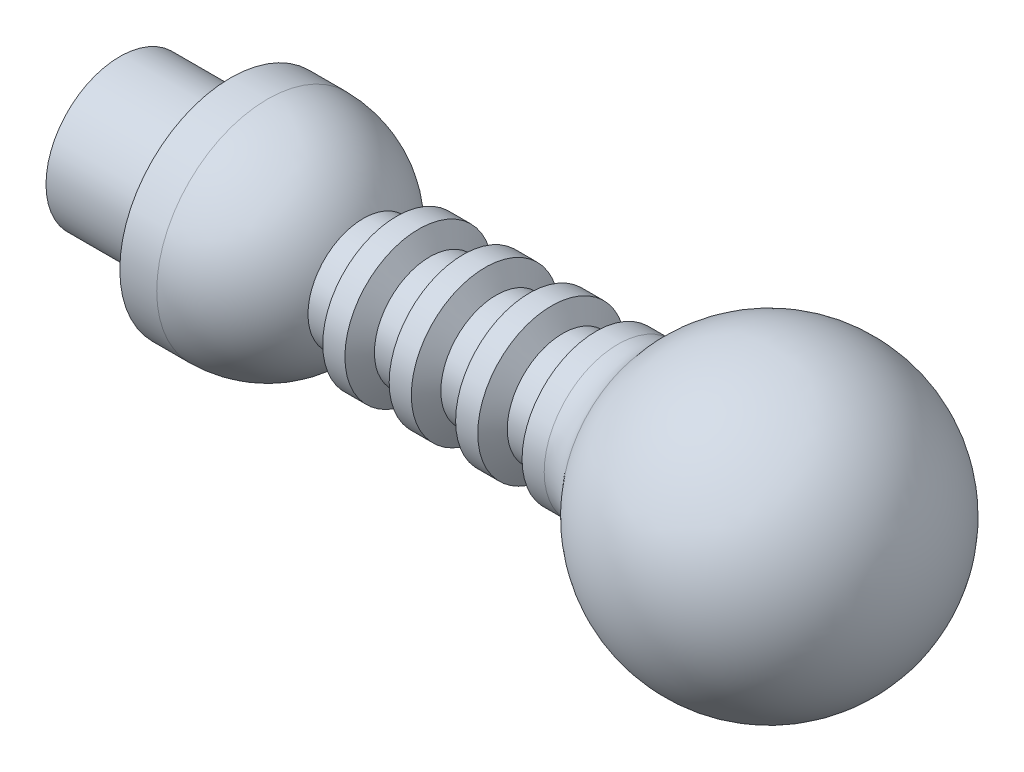
ISO-10303-21;
HEADER;
FILE_DESCRIPTION(('STEP AP214'),'2;1');
FILE_NAME('part.step','',(''),(''),'','','');
FILE_SCHEMA(('AUTOMOTIVE_DESIGN { 1 0 10303 214 1 1 1 1 }'));
ENDSEC;
DATA;
#1=APPLICATION_CONTEXT('core data for automotive mechanical design processes');
#2=APPLICATION_PROTOCOL_DEFINITION('international standard','automotive_design',2000,#1);
#3=PRODUCT_CONTEXT('',#1,'mechanical');
#4=PRODUCT('Part','Part','',(#3));
#5=PRODUCT_RELATED_PRODUCT_CATEGORY('part','',(#4));
#6=PRODUCT_DEFINITION_FORMATION('','',#4);
#7=PRODUCT_DEFINITION_CONTEXT('part definition',#1,'design');
#8=PRODUCT_DEFINITION('design','',#6,#7);
#9=PRODUCT_DEFINITION_SHAPE('','',#8);
#10=(LENGTH_UNIT() NAMED_UNIT(*) SI_UNIT(.MILLI.,.METRE.));
#11=(NAMED_UNIT(*) PLANE_ANGLE_UNIT() SI_UNIT($,.RADIAN.));
#12=(NAMED_UNIT(*) SI_UNIT($,.STERADIAN.) SOLID_ANGLE_UNIT());
#13=UNCERTAINTY_MEASURE_WITH_UNIT(LENGTH_MEASURE(1.E-05),#10,'distance_accuracy_value','');
#14=(GEOMETRIC_REPRESENTATION_CONTEXT(3) GLOBAL_UNCERTAINTY_ASSIGNED_CONTEXT((#13)) GLOBAL_UNIT_ASSIGNED_CONTEXT((#10,
#11,#12)) REPRESENTATION_CONTEXT('',''));
#15=CARTESIAN_POINT('',(0.,0.,0.));
#16=DIRECTION('',(0.,0.,1.));
#17=DIRECTION('',(1.,0.,0.));
#18=AXIS2_PLACEMENT_3D('',#15,#16,#17);
#19=CARTESIAN_POINT('',(0.,0.,0.));
#20=DIRECTION('',(1.,0.,0.));
#21=DIRECTION('',(0.,0.,-1.));
#22=AXIS2_PLACEMENT_3D('',#19,#20,#21);
#23=PLANE('',#22);
#24=CARTESIAN_POINT('',(0.,0.,0.));
#25=DIRECTION('',(-1.,0.,0.));
#26=DIRECTION('',(0.,0.,1.));
#27=AXIS2_PLACEMENT_3D('',#24,#25,#26);
#28=CIRCLE('',#27,10.);
#29=CARTESIAN_POINT('',(0.,0.,10.));
#30=VERTEX_POINT('',#29);
#31=EDGE_CURVE('E10',#30,#30,#28,.T.);
#32=ORIENTED_EDGE('',*,*,#31,.T.);
#33=EDGE_LOOP('',(#32));
#34=FACE_BOUND('',#33,.T.);
#35=ADVANCED_FACE('F43',(#34),#23,.F.);
#36=CARTESIAN_POINT('',(0.,0.,0.));
#37=DIRECTION('',(-1.,0.,0.));
#38=DIRECTION('',(0.,0.,1.));
#39=AXIS2_PLACEMENT_3D('',#36,#37,#38);
#40=CYLINDRICAL_SURFACE('',#39,10.);
#41=ORIENTED_EDGE('',*,*,#31,.F.);
#42=EDGE_LOOP('',(#41));
#43=FACE_BOUND('',#42,.T.);
#44=CARTESIAN_POINT('',(15.,0.,0.));
#45=DIRECTION('',(-1.,0.,0.));
#46=DIRECTION('',(0.,0.,1.));
#47=AXIS2_PLACEMENT_3D('',#44,#45,#46);
#48=CIRCLE('',#47,10.);
#49=CARTESIAN_POINT('',(15.,0.,10.));
#50=VERTEX_POINT('',#49);
#51=EDGE_CURVE('E50',#50,#50,#48,.T.);
#52=ORIENTED_EDGE('',*,*,#51,.T.);
#53=EDGE_LOOP('',(#52));
#54=FACE_BOUND('',#53,.T.);
#55=ADVANCED_FACE('F147',(#43,#54),#40,.T.);
#56=CARTESIAN_POINT('',(15.,10.,0.));
#57=DIRECTION('',(1.,0.,0.));
#58=DIRECTION('',(0.,0.,-1.));
#59=AXIS2_PLACEMENT_3D('',#56,#57,#58);
#60=PLANE('',#59);
#61=ORIENTED_EDGE('',*,*,#51,.F.);
#62=EDGE_LOOP('',(#61));
#63=FACE_BOUND('',#62,.T.);
#64=CARTESIAN_POINT('',(15.,0.,0.));
#65=DIRECTION('',(-1.,0.,0.));
#66=DIRECTION('',(0.,0.,1.));
#67=AXIS2_PLACEMENT_3D('',#64,#65,#66);
#68=CIRCLE('',#67,15.);
#69=CARTESIAN_POINT('',(15.,0.,15.));
#70=VERTEX_POINT('',#69);
#71=EDGE_CURVE('E55',#70,#70,#68,.T.);
#72=ORIENTED_EDGE('',*,*,#71,.T.);
#73=EDGE_LOOP('',(#72));
#74=FACE_BOUND('',#73,.T.);
#75=ADVANCED_FACE('F151',(#63,#74),#60,.F.);
#76=CARTESIAN_POINT('',(0.,0.,0.));
#77=DIRECTION('',(-1.,0.,0.));
#78=DIRECTION('',(0.,0.,1.));
#79=AXIS2_PLACEMENT_3D('',#76,#77,#78);
#80=CYLINDRICAL_SURFACE('',#79,15.);
#81=ORIENTED_EDGE('',*,*,#71,.F.);
#82=EDGE_LOOP('',(#81));
#83=FACE_BOUND('',#82,.T.);
#84=CARTESIAN_POINT('',(20.,0.,0.));
#85=DIRECTION('',(-1.,0.,0.));
#86=DIRECTION('',(0.,0.,1.));
#87=AXIS2_PLACEMENT_3D('',#84,#85,#86);
#88=CIRCLE('',#87,15.);
#89=CARTESIAN_POINT('',(20.,0.,15.));
#90=VERTEX_POINT('',#89);
#91=EDGE_CURVE('E60',#90,#90,#88,.T.);
#92=ORIENTED_EDGE('',*,*,#91,.T.);
#93=EDGE_LOOP('',(#92));
#94=FACE_BOUND('',#93,.T.);
#95=ADVANCED_FACE('F156',(#83,#94),#80,.T.);
#96=CARTESIAN_POINT('',(20.,0.,0.));
#97=DIRECTION('',(-1.,0.,0.));
#98=DIRECTION('',(0.,1.,0.));
#99=AXIS2_PLACEMENT_3D('',#96,#97,#98);
#100=SPHERICAL_SURFACE('',#99,15.);
#101=ORIENTED_EDGE('',*,*,#91,.F.);
#102=EDGE_LOOP('',(#101));
#103=FACE_BOUND('',#102,.T.);
#104=CARTESIAN_POINT('',(32.9903810567666,0.,0.));
#105=DIRECTION('',(-1.,0.,0.));
#106=DIRECTION('',(0.,0.,1.));
#107=AXIS2_PLACEMENT_3D('',#104,#105,#106);
#108=CIRCLE('',#107,7.5);
#109=CARTESIAN_POINT('',(32.9903810567666,0.,7.5));
#110=VERTEX_POINT('',#109);
#111=EDGE_CURVE('E66',#110,#110,#108,.T.);
#112=ORIENTED_EDGE('',*,*,#111,.T.);
#113=EDGE_LOOP('',(#112));
#114=FACE_BOUND('',#113,.T.);
#115=ADVANCED_FACE('F162',(#103,#114),#100,.T.);
#116=CARTESIAN_POINT('',(0.,0.,0.));
#117=DIRECTION('',(-1.,0.,0.));
#118=DIRECTION('',(0.,0.,1.));
#119=AXIS2_PLACEMENT_3D('',#116,#117,#118);
#120=CYLINDRICAL_SURFACE('',#119,7.5);
#121=ORIENTED_EDGE('',*,*,#111,.F.);
#122=EDGE_LOOP('',(#121));
#123=FACE_BOUND('',#122,.T.);
#124=CARTESIAN_POINT('',(35.9903810567666,0.,0.));
#125=DIRECTION('',(-1.,0.,0.));
#126=DIRECTION('',(0.,0.,1.));
#127=AXIS2_PLACEMENT_3D('',#124,#125,#126);
#128=CIRCLE('',#127,7.5);
#129=CARTESIAN_POINT('',(35.9903810567666,0.,7.5));
#130=VERTEX_POINT('',#129);
#131=EDGE_CURVE('E70',#130,#130,#128,.T.);
#132=ORIENTED_EDGE('',*,*,#131,.T.);
#133=EDGE_LOOP('',(#132));
#134=FACE_BOUND('',#133,.T.);
#135=ADVANCED_FACE('F166',(#123,#134),#120,.T.);
#136=CARTESIAN_POINT('',(37.4903810567666,0.,0.));
#137=DIRECTION('',(1.,0.,0.));
#138=DIRECTION('',(0.,0.,-1.));
#139=AXIS2_PLACEMENT_3D('',#136,#137,#138);
#140=CONICAL_SURFACE('',#139,10.,1.03037682652431);
#141=ORIENTED_EDGE('',*,*,#131,.F.);
#142=EDGE_LOOP('',(#141));
#143=FACE_BOUND('',#142,.T.);
#144=CARTESIAN_POINT('',(37.4903810567666,0.,0.));
#145=DIRECTION('',(-1.,0.,0.));
#146=DIRECTION('',(0.,0.,1.));
#147=AXIS2_PLACEMENT_3D('',#144,#145,#146);
#148=CIRCLE('',#147,10.);
#149=CARTESIAN_POINT('',(37.4903810567666,0.,10.));
#150=VERTEX_POINT('',#149);
#151=EDGE_CURVE('E74',#150,#150,#148,.T.);
#152=ORIENTED_EDGE('',*,*,#151,.T.);
#153=EDGE_LOOP('',(#152));
#154=FACE_BOUND('',#153,.T.);
#155=ADVANCED_FACE('F170',(#143,#154),#140,.T.);
#156=CARTESIAN_POINT('',(0.,0.,0.));
#157=DIRECTION('',(-1.,0.,0.));
#158=DIRECTION('',(0.,0.,1.));
#159=AXIS2_PLACEMENT_3D('',#156,#157,#158);
#160=CYLINDRICAL_SURFACE('',#159,10.);
#161=ORIENTED_EDGE('',*,*,#151,.F.);
#162=EDGE_LOOP('',(#161));
#163=FACE_BOUND('',#162,.T.);
#164=CARTESIAN_POINT('',(40.4903810567666,0.,0.));
#165=DIRECTION('',(-1.,0.,0.));
#166=DIRECTION('',(0.,0.,1.));
#167=AXIS2_PLACEMENT_3D('',#164,#165,#166);
#168=CIRCLE('',#167,10.);
#169=CARTESIAN_POINT('',(40.4903810567666,0.,10.));
#170=VERTEX_POINT('',#169);
#171=EDGE_CURVE('E78',#170,#170,#168,.T.);
#172=ORIENTED_EDGE('',*,*,#171,.T.);
#173=EDGE_LOOP('',(#172));
#174=FACE_BOUND('',#173,.T.);
#175=ADVANCED_FACE('F174',(#163,#174),#160,.T.);
#176=CARTESIAN_POINT('',(41.9903810567666,0.,0.));
#177=DIRECTION('',(-1.,0.,0.));
#178=DIRECTION('',(0.,0.,1.));
#179=AXIS2_PLACEMENT_3D('',#176,#177,#178);
#180=CONICAL_SURFACE('',#179,7.5,1.03037682652431);
#181=ORIENTED_EDGE('',*,*,#171,.F.);
#182=EDGE_LOOP('',(#181));
#183=FACE_BOUND('',#182,.T.);
#184=CARTESIAN_POINT('',(41.9903810567666,0.,0.));
#185=DIRECTION('',(-1.,0.,0.));
#186=DIRECTION('',(0.,0.,1.));
#187=AXIS2_PLACEMENT_3D('',#184,#185,#186);
#188=CIRCLE('',#187,7.5);
#189=CARTESIAN_POINT('',(41.9903810567666,0.,7.5));
#190=VERTEX_POINT('',#189);
#191=EDGE_CURVE('E82',#190,#190,#188,.T.);
#192=ORIENTED_EDGE('',*,*,#191,.T.);
#193=EDGE_LOOP('',(#192));
#194=FACE_BOUND('',#193,.T.);
#195=ADVANCED_FACE('F178',(#183,#194),#180,.T.);
#196=CARTESIAN_POINT('',(0.,0.,0.));
#197=DIRECTION('',(-1.,0.,0.));
#198=DIRECTION('',(0.,0.,1.));
#199=AXIS2_PLACEMENT_3D('',#196,#197,#198);
#200=CYLINDRICAL_SURFACE('',#199,7.5);
#201=ORIENTED_EDGE('',*,*,#191,.F.);
#202=EDGE_LOOP('',(#201));
#203=FACE_BOUND('',#202,.T.);
#204=CARTESIAN_POINT('',(44.9903810567666,0.,0.));
#205=DIRECTION('',(-1.,0.,0.));
#206=DIRECTION('',(0.,0.,1.));
#207=AXIS2_PLACEMENT_3D('',#204,#205,#206);
#208=CIRCLE('',#207,7.5);
#209=CARTESIAN_POINT('',(44.9903810567666,0.,7.5));
#210=VERTEX_POINT('',#209);
#211=EDGE_CURVE('E86',#210,#210,#208,.T.);
#212=ORIENTED_EDGE('',*,*,#211,.T.);
#213=EDGE_LOOP('',(#212));
#214=FACE_BOUND('',#213,.T.);
#215=ADVANCED_FACE('F182',(#203,#214),#200,.T.);
#216=CARTESIAN_POINT('',(46.4903810567666,0.,0.));
#217=DIRECTION('',(1.,0.,0.));
#218=DIRECTION('',(0.,0.,-1.));
#219=AXIS2_PLACEMENT_3D('',#216,#217,#218);
#220=CONICAL_SURFACE('',#219,10.,1.03037682652431);
#221=ORIENTED_EDGE('',*,*,#211,.F.);
#222=EDGE_LOOP('',(#221));
#223=FACE_BOUND('',#222,.T.);
#224=CARTESIAN_POINT('',(46.4903810567666,0.,0.));
#225=DIRECTION('',(-1.,0.,0.));
#226=DIRECTION('',(0.,0.,1.));
#227=AXIS2_PLACEMENT_3D('',#224,#225,#226);
#228=CIRCLE('',#227,10.);
#229=CARTESIAN_POINT('',(46.4903810567666,0.,10.));
#230=VERTEX_POINT('',#229);
#231=EDGE_CURVE('E90',#230,#230,#228,.T.);
#232=ORIENTED_EDGE('',*,*,#231,.T.);
#233=EDGE_LOOP('',(#232));
#234=FACE_BOUND('',#233,.T.);
#235=ADVANCED_FACE('F186',(#223,#234),#220,.T.);
#236=CARTESIAN_POINT('',(0.,0.,0.));
#237=DIRECTION('',(-1.,0.,0.));
#238=DIRECTION('',(0.,0.,1.));
#239=AXIS2_PLACEMENT_3D('',#236,#237,#238);
#240=CYLINDRICAL_SURFACE('',#239,10.);
#241=ORIENTED_EDGE('',*,*,#231,.F.);
#242=EDGE_LOOP('',(#241));
#243=FACE_BOUND('',#242,.T.);
#244=CARTESIAN_POINT('',(49.4903810567666,0.,0.));
#245=DIRECTION('',(-1.,0.,0.));
#246=DIRECTION('',(0.,0.,1.));
#247=AXIS2_PLACEMENT_3D('',#244,#245,#246);
#248=CIRCLE('',#247,10.);
#249=CARTESIAN_POINT('',(49.4903810567666,0.,10.));
#250=VERTEX_POINT('',#249);
#251=EDGE_CURVE('E94',#250,#250,#248,.T.);
#252=ORIENTED_EDGE('',*,*,#251,.T.);
#253=EDGE_LOOP('',(#252));
#254=FACE_BOUND('',#253,.T.);
#255=ADVANCED_FACE('F190',(#243,#254),#240,.T.);
#256=CARTESIAN_POINT('',(50.9903810567666,0.,0.));
#257=DIRECTION('',(-1.,0.,0.));
#258=DIRECTION('',(0.,0.,1.));
#259=AXIS2_PLACEMENT_3D('',#256,#257,#258);
#260=CONICAL_SURFACE('',#259,7.5,1.03037682652431);
#261=ORIENTED_EDGE('',*,*,#251,.F.);
#262=EDGE_LOOP('',(#261));
#263=FACE_BOUND('',#262,.T.);
#264=CARTESIAN_POINT('',(50.9903810567666,0.,0.));
#265=DIRECTION('',(-1.,0.,0.));
#266=DIRECTION('',(0.,0.,1.));
#267=AXIS2_PLACEMENT_3D('',#264,#265,#266);
#268=CIRCLE('',#267,7.5);
#269=CARTESIAN_POINT('',(50.9903810567666,0.,7.5));
#270=VERTEX_POINT('',#269);
#271=EDGE_CURVE('E98',#270,#270,#268,.T.);
#272=ORIENTED_EDGE('',*,*,#271,.T.);
#273=EDGE_LOOP('',(#272));
#274=FACE_BOUND('',#273,.T.);
#275=ADVANCED_FACE('F194',(#263,#274),#260,.T.);
#276=CARTESIAN_POINT('',(0.,0.,0.));
#277=DIRECTION('',(-1.,0.,0.));
#278=DIRECTION('',(0.,0.,1.));
#279=AXIS2_PLACEMENT_3D('',#276,#277,#278);
#280=CYLINDRICAL_SURFACE('',#279,7.5);
#281=ORIENTED_EDGE('',*,*,#271,.F.);
#282=EDGE_LOOP('',(#281));
#283=FACE_BOUND('',#282,.T.);
#284=CARTESIAN_POINT('',(53.9903810567666,0.,0.));
#285=DIRECTION('',(-1.,0.,0.));
#286=DIRECTION('',(0.,0.,1.));
#287=AXIS2_PLACEMENT_3D('',#284,#285,#286);
#288=CIRCLE('',#287,7.5);
#289=CARTESIAN_POINT('',(53.9903810567666,0.,7.5));
#290=VERTEX_POINT('',#289);
#291=EDGE_CURVE('E102',#290,#290,#288,.T.);
#292=ORIENTED_EDGE('',*,*,#291,.T.);
#293=EDGE_LOOP('',(#292));
#294=FACE_BOUND('',#293,.T.);
#295=ADVANCED_FACE('F198',(#283,#294),#280,.T.);
#296=CARTESIAN_POINT('',(55.4903810567666,0.,0.));
#297=DIRECTION('',(1.,0.,0.));
#298=DIRECTION('',(0.,0.,-1.));
#299=AXIS2_PLACEMENT_3D('',#296,#297,#298);
#300=CONICAL_SURFACE('',#299,10.,1.03037682652431);
#301=ORIENTED_EDGE('',*,*,#291,.F.);
#302=EDGE_LOOP('',(#301));
#303=FACE_BOUND('',#302,.T.);
#304=CARTESIAN_POINT('',(55.4903810567666,0.,0.));
#305=DIRECTION('',(-1.,0.,0.));
#306=DIRECTION('',(0.,0.,1.));
#307=AXIS2_PLACEMENT_3D('',#304,#305,#306);
#308=CIRCLE('',#307,10.);
#309=CARTESIAN_POINT('',(55.4903810567666,0.,10.));
#310=VERTEX_POINT('',#309);
#311=EDGE_CURVE('E106',#310,#310,#308,.T.);
#312=ORIENTED_EDGE('',*,*,#311,.T.);
#313=EDGE_LOOP('',(#312));
#314=FACE_BOUND('',#313,.T.);
#315=ADVANCED_FACE('F202',(#303,#314),#300,.T.);
#316=CARTESIAN_POINT('',(0.,0.,0.));
#317=DIRECTION('',(-1.,0.,0.));
#318=DIRECTION('',(0.,0.,1.));
#319=AXIS2_PLACEMENT_3D('',#316,#317,#318);
#320=CYLINDRICAL_SURFACE('',#319,10.);
#321=ORIENTED_EDGE('',*,*,#311,.F.);
#322=EDGE_LOOP('',(#321));
#323=FACE_BOUND('',#322,.T.);
#324=CARTESIAN_POINT('',(58.4903810567666,0.,0.));
#325=DIRECTION('',(-1.,0.,0.));
#326=DIRECTION('',(0.,0.,1.));
#327=AXIS2_PLACEMENT_3D('',#324,#325,#326);
#328=CIRCLE('',#327,10.);
#329=CARTESIAN_POINT('',(58.4903810567666,0.,10.));
#330=VERTEX_POINT('',#329);
#331=EDGE_CURVE('E110',#330,#330,#328,.T.);
#332=ORIENTED_EDGE('',*,*,#331,.T.);
#333=EDGE_LOOP('',(#332));
#334=FACE_BOUND('',#333,.T.);
#335=ADVANCED_FACE('F206',(#323,#334),#320,.T.);
#336=CARTESIAN_POINT('',(59.9903810567666,0.,0.));
#337=DIRECTION('',(-1.,0.,0.));
#338=DIRECTION('',(0.,0.,1.));
#339=AXIS2_PLACEMENT_3D('',#336,#337,#338);
#340=CONICAL_SURFACE('',#339,7.5,1.03037682652431);
#341=ORIENTED_EDGE('',*,*,#331,.F.);
#342=EDGE_LOOP('',(#341));
#343=FACE_BOUND('',#342,.T.);
#344=CARTESIAN_POINT('',(59.9903810567666,0.,0.));
#345=DIRECTION('',(-1.,0.,0.));
#346=DIRECTION('',(0.,0.,1.));
#347=AXIS2_PLACEMENT_3D('',#344,#345,#346);
#348=CIRCLE('',#347,7.5);
#349=CARTESIAN_POINT('',(59.9903810567666,0.,7.5));
#350=VERTEX_POINT('',#349);
#351=EDGE_CURVE('E114',#350,#350,#348,.T.);
#352=ORIENTED_EDGE('',*,*,#351,.T.);
#353=EDGE_LOOP('',(#352));
#354=FACE_BOUND('',#353,.T.);
#355=ADVANCED_FACE('F210',(#343,#354),#340,.T.);
#356=CARTESIAN_POINT('',(0.,0.,0.));
#357=DIRECTION('',(-1.,0.,0.));
#358=DIRECTION('',(0.,0.,1.));
#359=AXIS2_PLACEMENT_3D('',#356,#357,#358);
#360=CYLINDRICAL_SURFACE('',#359,7.5);
#361=ORIENTED_EDGE('',*,*,#351,.F.);
#362=EDGE_LOOP('',(#361));
#363=FACE_BOUND('',#362,.T.);
#364=CARTESIAN_POINT('',(62.9903810567666,0.,0.));
#365=DIRECTION('',(-1.,0.,0.));
#366=DIRECTION('',(0.,0.,1.));
#367=AXIS2_PLACEMENT_3D('',#364,#365,#366);
#368=CIRCLE('',#367,7.5);
#369=CARTESIAN_POINT('',(62.9903810567666,0.,7.5));
#370=VERTEX_POINT('',#369);
#371=EDGE_CURVE('E118',#370,#370,#368,.T.);
#372=ORIENTED_EDGE('',*,*,#371,.T.);
#373=EDGE_LOOP('',(#372));
#374=FACE_BOUND('',#373,.T.);
#375=ADVANCED_FACE('F214',(#363,#374),#360,.T.);
#376=CARTESIAN_POINT('',(64.4903810567666,0.,0.));
#377=DIRECTION('',(1.,0.,0.));
#378=DIRECTION('',(0.,0.,-1.));
#379=AXIS2_PLACEMENT_3D('',#376,#377,#378);
#380=CONICAL_SURFACE('',#379,10.,1.03037682652431);
#381=ORIENTED_EDGE('',*,*,#371,.F.);
#382=EDGE_LOOP('',(#381));
#383=FACE_BOUND('',#382,.T.);
#384=CARTESIAN_POINT('',(64.4903810567666,0.,0.));
#385=DIRECTION('',(-1.,0.,0.));
#386=DIRECTION('',(0.,0.,1.));
#387=AXIS2_PLACEMENT_3D('',#384,#385,#386);
#388=CIRCLE('',#387,10.);
#389=CARTESIAN_POINT('',(64.4903810567666,0.,10.));
#390=VERTEX_POINT('',#389);
#391=EDGE_CURVE('E122',#390,#390,#388,.T.);
#392=ORIENTED_EDGE('',*,*,#391,.T.);
#393=EDGE_LOOP('',(#392));
#394=FACE_BOUND('',#393,.T.);
#395=ADVANCED_FACE('F218',(#383,#394),#380,.T.);
#396=CARTESIAN_POINT('',(0.,0.,0.));
#397=DIRECTION('',(-1.,0.,0.));
#398=DIRECTION('',(0.,0.,1.));
#399=AXIS2_PLACEMENT_3D('',#396,#397,#398);
#400=CYLINDRICAL_SURFACE('',#399,10.);
#401=ORIENTED_EDGE('',*,*,#391,.F.);
#402=EDGE_LOOP('',(#401));
#403=FACE_BOUND('',#402,.T.);
#404=CARTESIAN_POINT('',(67.4903810567666,0.,0.));
#405=DIRECTION('',(-1.,0.,0.));
#406=DIRECTION('',(0.,0.,1.));
#407=AXIS2_PLACEMENT_3D('',#404,#405,#406);
#408=CIRCLE('',#407,10.);
#409=CARTESIAN_POINT('',(67.4903810567666,0.,10.));
#410=VERTEX_POINT('',#409);
#411=EDGE_CURVE('E126',#410,#410,#408,.T.);
#412=ORIENTED_EDGE('',*,*,#411,.T.);
#413=EDGE_LOOP('',(#412));
#414=FACE_BOUND('',#413,.T.);
#415=ADVANCED_FACE('F143',(#403,#414),#400,.T.);
#416=CARTESIAN_POINT('',(67.4903810567667,0.,0.));
#417=DIRECTION('',(-1.,0.,0.));
#418=DIRECTION('',(0.,0.,1.));
#419=AXIS2_PLACEMENT_3D('',#416,#417,#418);
#420=TOROIDAL_SURFACE('',#419,16.,5.99999999999997);
#421=ORIENTED_EDGE('',*,*,#411,.F.);
#422=EDGE_LOOP('',(#421));
#423=FACE_BOUND('',#422,.T.);
#424=CARTESIAN_POINT('',(72.2197429487479,0.,0.));
#425=DIRECTION('',(-1.,0.,0.));
#426=DIRECTION('',(0.,0.,1.));
#427=AXIS2_PLACEMENT_3D('',#424,#425,#426);
#428=CIRCLE('',#427,12.3076923076923);
#429=CARTESIAN_POINT('',(72.2197429487479,0.,12.3076923076923));
#430=VERTEX_POINT('',#429);
#431=EDGE_CURVE('E130',#430,#430,#428,.T.);
#432=ORIENTED_EDGE('',*,*,#431,.T.);
#433=EDGE_LOOP('',(#432));
#434=FACE_BOUND('',#433,.T.);
#435=ADVANCED_FACE('F135',(#423,#434),#420,.F.);
#436=CARTESIAN_POINT('',(87.9842825886858,0.,0.));
#437=DIRECTION('',(-1.,0.,0.));
#438=DIRECTION('',(0.,1.,0.));
#439=AXIS2_PLACEMENT_3D('',#436,#437,#438);
#440=SPHERICAL_SURFACE('',#439,20.);
#441=ORIENTED_EDGE('',*,*,#431,.F.);
#442=EDGE_LOOP('',(#441));
#443=FACE_BOUND('',#442,.T.);
#444=ADVANCED_FACE('F137',(#443),#440,.T.);
#445=CLOSED_SHELL('',(#35,#55,#75,#95,#115,#135,#155,#175,#195,#215,#235,#255,#275,#295,#315,
#335,#355,#375,#395,#415,#435,#444));
#446=MANIFOLD_SOLID_BREP('B2',#445);
#447=ADVANCED_BREP_SHAPE_REPRESENTATION('',(#18,#446),#14);
#448=SHAPE_DEFINITION_REPRESENTATION(#9,#447);
ENDSEC;
END-ISO-10303-21;
